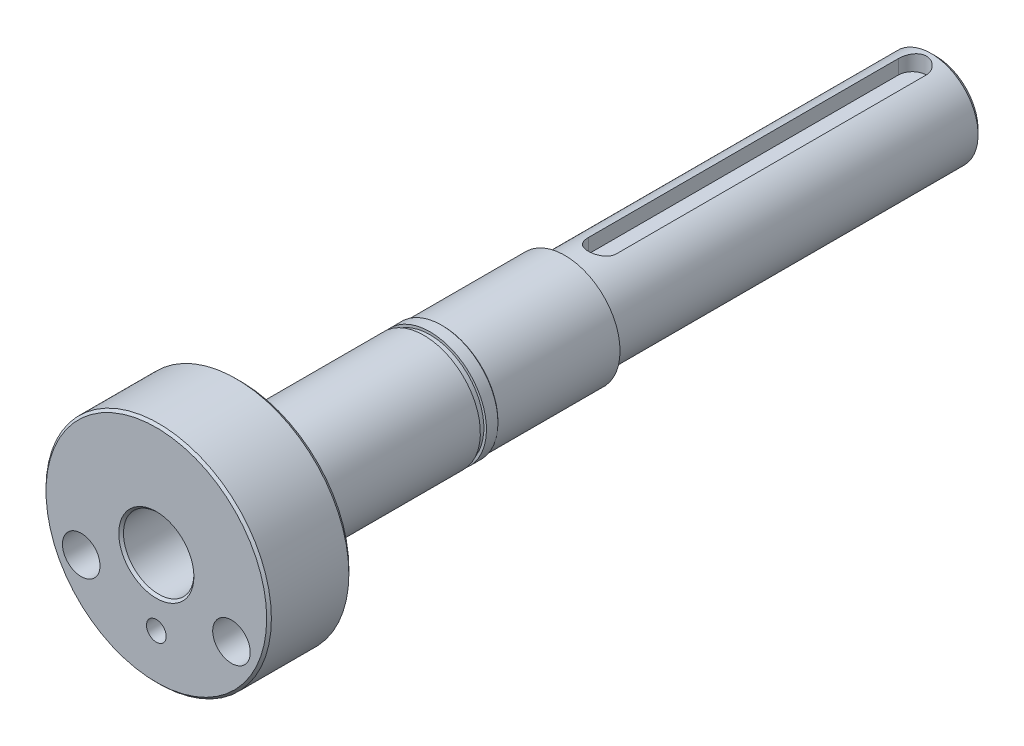
ISO-10303-21;
HEADER;
FILE_DESCRIPTION(('STEP AP214'),'2;1');
FILE_NAME('part.step','',(''),(''),'','','');
FILE_SCHEMA(('AUTOMOTIVE_DESIGN { 1 0 10303 214 1 1 1 1 }'));
ENDSEC;
DATA;
#1=APPLICATION_CONTEXT('core data for automotive mechanical design processes');
#2=APPLICATION_PROTOCOL_DEFINITION('international standard','automotive_design',2000,#1);
#3=PRODUCT_CONTEXT('',#1,'mechanical');
#4=PRODUCT('Part','Part','',(#3));
#5=PRODUCT_RELATED_PRODUCT_CATEGORY('part','',(#4));
#6=PRODUCT_DEFINITION_FORMATION('','',#4);
#7=PRODUCT_DEFINITION_CONTEXT('part definition',#1,'design');
#8=PRODUCT_DEFINITION('design','',#6,#7);
#9=PRODUCT_DEFINITION_SHAPE('','',#8);
#10=(LENGTH_UNIT() NAMED_UNIT(*) SI_UNIT(.MILLI.,.METRE.));
#11=(NAMED_UNIT(*) PLANE_ANGLE_UNIT() SI_UNIT($,.RADIAN.));
#12=(NAMED_UNIT(*) SI_UNIT($,.STERADIAN.) SOLID_ANGLE_UNIT());
#13=UNCERTAINTY_MEASURE_WITH_UNIT(LENGTH_MEASURE(1.E-05),#10,'distance_accuracy_value','');
#14=(GEOMETRIC_REPRESENTATION_CONTEXT(3) GLOBAL_UNCERTAINTY_ASSIGNED_CONTEXT((#13)) GLOBAL_UNIT_ASSIGNED_CONTEXT((#10,
#11,#12)) REPRESENTATION_CONTEXT('',''));
#15=CARTESIAN_POINT('',(0.,0.,0.));
#16=DIRECTION('',(0.,0.,1.));
#17=DIRECTION('',(1.,0.,0.));
#18=AXIS2_PLACEMENT_3D('',#15,#16,#17);
#19=CARTESIAN_POINT('',(0.,0.,0.));
#20=DIRECTION('',(0.,0.,1.));
#21=DIRECTION('',(1.00000000000001,0.,0.));
#22=AXIS2_PLACEMENT_3D('',#19,#20,#21);
#23=PLANE('',#22);
#24=CARTESIAN_POINT('',(0.,0.,0.));
#25=DIRECTION('',(0.,0.,1.));
#26=DIRECTION('',(1.00000000000001,0.,0.));
#27=AXIS2_PLACEMENT_3D('',#24,#25,#26);
#28=CIRCLE('',#27,23.);
#29=CARTESIAN_POINT('',(23.0000000000002,0.,0.));
#30=VERTEX_POINT('',#29);
#31=EDGE_CURVE('E168',#30,#30,#28,.F.);
#32=ORIENTED_EDGE('',*,*,#31,.T.);
#33=EDGE_LOOP('',(#32));
#34=FACE_BOUND('',#33,.T.);
#35=CARTESIAN_POINT('',(16.0000000000001,-8.00000000000045,0.));
#36=DIRECTION('',(0.,0.,1.));
#37=DIRECTION('',(1.00000000000001,0.,0.));
#38=AXIS2_PLACEMENT_3D('',#35,#36,#37);
#39=CIRCLE('',#38,3.99999999999999);
#40=CARTESIAN_POINT('',(20.0000000000002,-8.00000000000045,0.));
#41=VERTEX_POINT('',#40);
#42=EDGE_CURVE('E136',#41,#41,#39,.T.);
#43=ORIENTED_EDGE('',*,*,#42,.T.);
#44=EDGE_LOOP('',(#43));
#45=FACE_BOUND('',#44,.T.);
#46=CARTESIAN_POINT('',(-16.0000000000002,-8.00000000000006,-1.2490009027033E-13));
#47=DIRECTION('',(0.,0.,1.));
#48=DIRECTION('',(1.00000000000001,0.,0.));
#49=AXIS2_PLACEMENT_3D('',#46,#47,#48);
#50=CIRCLE('',#49,4.);
#51=CARTESIAN_POINT('',(-12.0000000000001,-8.00000000000006,-1.2490009027033E-13));
#52=VERTEX_POINT('',#51);
#53=EDGE_CURVE('E132',#52,#52,#50,.T.);
#54=ORIENTED_EDGE('',*,*,#53,.T.);
#55=EDGE_LOOP('',(#54));
#56=FACE_BOUND('',#55,.T.);
#57=CARTESIAN_POINT('',(0.,-14.,0.));
#58=DIRECTION('',(0.,0.,1.));
#59=DIRECTION('',(1.00000000000001,0.,0.));
#60=AXIS2_PLACEMENT_3D('',#57,#58,#59);
#61=CIRCLE('',#60,2.09999999999999);
#62=CARTESIAN_POINT('',(0.592633240852417,-11.9853571428571,0.));
#63=VERTEX_POINT('',#62);
#64=CARTESIAN_POINT('',(-0.592633240852417,-11.9853571428576,0.));
#65=VERTEX_POINT('',#64);
#66=EDGE_CURVE('E127',#63,#65,#61,.F.);
#67=ORIENTED_EDGE('',*,*,#66,.F.);
#68=CARTESIAN_POINT('',(0.,0.,0.));
#69=DIRECTION('',(0.,0.,1.));
#70=DIRECTION('',(1.00000000000001,0.,0.));
#71=AXIS2_PLACEMENT_3D('',#68,#69,#70);
#72=CIRCLE('',#71,12.);
#73=EDGE_CURVE('E161',#65,#63,#72,.F.);
#74=ORIENTED_EDGE('',*,*,#73,.F.);
#75=EDGE_LOOP('',(#67,#74));
#76=FACE_BOUND('',#75,.T.);
#77=ADVANCED_FACE('F36',(#34,#45,#56,#76),#23,.F.);
#78=CARTESIAN_POINT('',(0.,-4.9960036108132E-13,18.));
#79=DIRECTION('',(0.,0.,1.));
#80=DIRECTION('',(1.00000000000001,0.,0.));
#81=AXIS2_PLACEMENT_3D('',#78,#79,#80);
#82=PLANE('',#81);
#83=CARTESIAN_POINT('',(0.,-14.0000000000005,18.));
#84=DIRECTION('',(0.,0.,1.));
#85=DIRECTION('',(1.00000000000001,0.,0.));
#86=AXIS2_PLACEMENT_3D('',#83,#84,#85);
#87=CIRCLE('',#86,2.09999999999999);
#88=CARTESIAN_POINT('',(2.10000000000005,-14.0000000000005,18.));
#89=VERTEX_POINT('',#88);
#90=EDGE_CURVE('E117',#89,#89,#87,.T.);
#91=ORIENTED_EDGE('',*,*,#90,.F.);
#92=EDGE_LOOP('',(#91));
#93=FACE_BOUND('',#92,.T.);
#94=CARTESIAN_POINT('',(-16.,-8.00000000000001,18.));
#95=DIRECTION('',(0.,0.,1.));
#96=DIRECTION('',(1.00000000000001,0.,0.));
#97=AXIS2_PLACEMENT_3D('',#94,#95,#96);
#98=CIRCLE('',#97,4.);
#99=CARTESIAN_POINT('',(-12.,-8.00000000000001,18.));
#100=VERTEX_POINT('',#99);
#101=EDGE_CURVE('E129',#100,#100,#98,.T.);
#102=ORIENTED_EDGE('',*,*,#101,.F.);
#103=EDGE_LOOP('',(#102));
#104=FACE_BOUND('',#103,.T.);
#105=CARTESIAN_POINT('',(16.0000000000002,-8.00000000000001,18.));
#106=DIRECTION('',(0.,0.,1.));
#107=DIRECTION('',(1.00000000000001,0.,0.));
#108=AXIS2_PLACEMENT_3D('',#105,#106,#107);
#109=CIRCLE('',#108,3.99999999999999);
#110=CARTESIAN_POINT('',(20.0000000000003,-8.00000000000001,18.));
#111=VERTEX_POINT('',#110);
#112=EDGE_CURVE('E133',#111,#111,#109,.T.);
#113=ORIENTED_EDGE('',*,*,#112,.F.);
#114=EDGE_LOOP('',(#113));
#115=FACE_BOUND('',#114,.T.);
#116=CARTESIAN_POINT('',(0.,-4.9960036108132E-13,18.));
#117=DIRECTION('',(0.,0.,1.));
#118=DIRECTION('',(1.00000000000001,0.,0.));
#119=AXIS2_PLACEMENT_3D('',#116,#117,#118);
#120=CIRCLE('',#119,8.);
#121=CARTESIAN_POINT('',(8.00000000000011,-4.99600361081321E-13,18.));
#122=VERTEX_POINT('',#121);
#123=EDGE_CURVE('E186',#122,#122,#120,.F.);
#124=ORIENTED_EDGE('',*,*,#123,.T.);
#125=EDGE_LOOP('',(#124));
#126=FACE_BOUND('',#125,.T.);
#127=CARTESIAN_POINT('',(0.,-4.9960036108132E-13,18.));
#128=DIRECTION('',(0.,0.,1.));
#129=DIRECTION('',(1.00000000000001,0.,0.));
#130=AXIS2_PLACEMENT_3D('',#127,#128,#129);
#131=CIRCLE('',#130,23.5);
#132=CARTESIAN_POINT('',(23.5000000000002,-4.99600361081322E-13,18.));
#133=VERTEX_POINT('',#132);
#134=EDGE_CURVE('E177',#133,#133,#131,.T.);
#135=ORIENTED_EDGE('',*,*,#134,.T.);
#136=EDGE_LOOP('',(#135));
#137=FACE_BOUND('',#136,.T.);
#138=ADVANCED_FACE('F274',(#93,#104,#115,#126,#137),#82,.T.);
#139=CARTESIAN_POINT('',(0.,-4.9960036108132E-13,-69.));
#140=DIRECTION('',(0.,0.,-1.));
#141=DIRECTION('',(-1.00000000000001,0.,0.));
#142=AXIS2_PLACEMENT_3D('',#139,#140,#141);
#143=PLANE('',#142);
#144=CARTESIAN_POINT('',(0.,-4.9960036108132E-13,-69.));
#145=DIRECTION('',(0.,0.,-1.));
#146=DIRECTION('',(-1.00000000000001,0.,0.));
#147=AXIS2_PLACEMENT_3D('',#144,#145,#146);
#148=CIRCLE('',#147,11.75);
#149=CARTESIAN_POINT('',(11.7500000000001,-4.99600361081321E-13,-69.));
#150=VERTEX_POINT('',#149);
#151=EDGE_CURVE('E146',#150,#150,#148,.T.);
#152=ORIENTED_EDGE('',*,*,#151,.T.);
#153=EDGE_LOOP('',(#152));
#154=FACE_BOUND('',#153,.T.);
#155=CARTESIAN_POINT('',(0.,-4.9960036108132E-13,-69.));
#156=DIRECTION('',(0.,0.,-1.));
#157=DIRECTION('',(-1.00000000000001,0.,0.));
#158=AXIS2_PLACEMENT_3D('',#155,#156,#157);
#159=CIRCLE('',#158,10.);
#160=CARTESIAN_POINT('',(-10.,-4.9960036108132E-13,-69.));
#161=VERTEX_POINT('',#160);
#162=EDGE_CURVE('E140',#161,#161,#159,.T.);
#163=ORIENTED_EDGE('',*,*,#162,.F.);
#164=EDGE_LOOP('',(#163));
#165=FACE_BOUND('',#164,.T.);
#166=ADVANCED_FACE('F280',(#154,#165),#143,.T.);
#167=CARTESIAN_POINT('',(0.,-4.9960036108132E-13,-39.));
#168=DIRECTION('',(0.,0.,-1.));
#169=DIRECTION('',(-1.00000000000001,0.,0.));
#170=AXIS2_PLACEMENT_3D('',#167,#168,#169);
#171=PLANE('',#170);
#172=CARTESIAN_POINT('',(0.,-4.9960036108132E-13,-39.));
#173=DIRECTION('',(0.,0.,-1.));
#174=DIRECTION('',(-1.00000000000001,0.,0.));
#175=AXIS2_PLACEMENT_3D('',#172,#173,#174);
#176=CIRCLE('',#175,12.);
#177=CARTESIAN_POINT('',(-12.0000000000001,-4.9960036108132E-13,-39.));
#178=VERTEX_POINT('',#177);
#179=EDGE_CURVE('E158',#178,#178,#176,.T.);
#180=ORIENTED_EDGE('',*,*,#179,.T.);
#181=EDGE_LOOP('',(#180));
#182=FACE_BOUND('',#181,.T.);
#183=CARTESIAN_POINT('',(0.,-4.9960036108132E-13,-39.));
#184=DIRECTION('',(0.,0.,-1.));
#185=DIRECTION('',(-1.00000000000001,0.,0.));
#186=AXIS2_PLACEMENT_3D('',#183,#184,#185);
#187=CIRCLE('',#186,11.45);
#188=CARTESIAN_POINT('',(-11.4500000000001,-4.9960036108132E-13,-39.));
#189=VERTEX_POINT('',#188);
#190=EDGE_CURVE('E152',#189,#189,#187,.T.);
#191=ORIENTED_EDGE('',*,*,#190,.F.);
#192=EDGE_LOOP('',(#191));
#193=FACE_BOUND('',#192,.T.);
#194=ADVANCED_FACE('F289',(#182,#193),#171,.T.);
#195=CARTESIAN_POINT('',(0.,-4.9960036108132E-13,18.));
#196=DIRECTION('',(0.,0.,-1.));
#197=DIRECTION('',(-1.00000000000001,0.,0.));
#198=AXIS2_PLACEMENT_3D('',#195,#196,#197);
#199=CYLINDRICAL_SURFACE('',#198,24.);
#200=CARTESIAN_POINT('',(0.,-4.9960036108132E-13,17.5));
#201=DIRECTION('',(0.,0.,1.));
#202=DIRECTION('',(1.00000000000001,0.,0.));
#203=AXIS2_PLACEMENT_3D('',#200,#201,#202);
#204=CIRCLE('',#203,24.);
#205=CARTESIAN_POINT('',(24.0000000000002,-4.99600361081322E-13,17.5));
#206=VERTEX_POINT('',#205);
#207=EDGE_CURVE('E180',#206,#206,#204,.F.);
#208=ORIENTED_EDGE('',*,*,#207,.T.);
#209=EDGE_LOOP('',(#208));
#210=FACE_BOUND('',#209,.T.);
#211=CARTESIAN_POINT('',(0.,0.,1.));
#212=DIRECTION('',(0.,0.,1.));
#213=DIRECTION('',(1.00000000000001,0.,0.));
#214=AXIS2_PLACEMENT_3D('',#211,#212,#213);
#215=CIRCLE('',#214,24.);
#216=CARTESIAN_POINT('',(24.0000000000002,0.,1.));
#217=VERTEX_POINT('',#216);
#218=EDGE_CURVE('E165',#217,#217,#215,.T.);
#219=ORIENTED_EDGE('',*,*,#218,.T.);
#220=EDGE_LOOP('',(#219));
#221=FACE_BOUND('',#220,.T.);
#222=ADVANCED_FACE('F38',(#210,#221),#199,.T.);
#223=CARTESIAN_POINT('',(0.,-4.9960036108132E-13,-39.));
#224=DIRECTION('',(0.,0.,1.));
#225=DIRECTION('',(1.00000000000001,0.,0.));
#226=AXIS2_PLACEMENT_3D('',#223,#224,#225);
#227=CYLINDRICAL_SURFACE('',#226,12.);
#228=ORIENTED_EDGE('',*,*,#179,.F.);
#229=EDGE_LOOP('',(#228));
#230=FACE_BOUND('',#229,.T.);
#231=EDGE_CURVE('E162',#63,#65,#72,.F.);
#232=ORIENTED_EDGE('',*,*,#231,.T.);
#233=ORIENTED_EDGE('',*,*,#73,.T.);
#234=EDGE_LOOP('',(#232,#233));
#235=FACE_BOUND('',#234,.T.);
#236=ADVANCED_FACE('F284',(#230,#235),#227,.T.);
#237=CARTESIAN_POINT('',(0.,0.,-40.3));
#238=DIRECTION('',(0.,0.,1.));
#239=DIRECTION('',(1.00000000000001,0.,0.));
#240=AXIS2_PLACEMENT_3D('',#237,#238,#239);
#241=CYLINDRICAL_SURFACE('',#240,11.45);
#242=CARTESIAN_POINT('',(0.,0.,-40.3));
#243=DIRECTION('',(0.,0.,-1.));
#244=DIRECTION('',(-1.00000000000001,0.,0.));
#245=AXIS2_PLACEMENT_3D('',#242,#243,#244);
#246=CIRCLE('',#245,11.45);
#247=CARTESIAN_POINT('',(-11.4500000000001,0.,-40.3));
#248=VERTEX_POINT('',#247);
#249=EDGE_CURVE('E155',#248,#248,#246,.T.);
#250=ORIENTED_EDGE('',*,*,#249,.F.);
#251=EDGE_LOOP('',(#250));
#252=FACE_BOUND('',#251,.T.);
#253=ORIENTED_EDGE('',*,*,#190,.T.);
#254=EDGE_LOOP('',(#253));
#255=FACE_BOUND('',#254,.T.);
#256=ADVANCED_FACE('F287',(#252,#255),#241,.T.);
#257=CARTESIAN_POINT('',(0.,0.,-40.3));
#258=DIRECTION('',(0.,0.,-1.));
#259=DIRECTION('',(-1.00000000000001,0.,0.));
#260=AXIS2_PLACEMENT_3D('',#257,#258,#259);
#261=PLANE('',#260);
#262=CARTESIAN_POINT('',(0.,0.,-40.3));
#263=DIRECTION('',(0.,0.,-1.));
#264=DIRECTION('',(-1.00000000000001,0.,0.));
#265=AXIS2_PLACEMENT_3D('',#262,#263,#264);
#266=CIRCLE('',#265,12.);
#267=CARTESIAN_POINT('',(-12.0000000000001,0.,-40.3));
#268=VERTEX_POINT('',#267);
#269=EDGE_CURVE('E149',#268,#268,#266,.T.);
#270=ORIENTED_EDGE('',*,*,#269,.F.);
#271=EDGE_LOOP('',(#270));
#272=FACE_BOUND('',#271,.T.);
#273=ORIENTED_EDGE('',*,*,#249,.T.);
#274=EDGE_LOOP('',(#273));
#275=FACE_BOUND('',#274,.T.);
#276=ADVANCED_FACE('F295',(#272,#275),#261,.F.);
#277=CARTESIAN_POINT('',(0.,0.,-43.));
#278=DIRECTION('',(0.,0.,1.));
#279=DIRECTION('',(1.00000000000001,0.,0.));
#280=AXIS2_PLACEMENT_3D('',#277,#278,#279);
#281=CYLINDRICAL_SURFACE('',#280,12.);
#282=CARTESIAN_POINT('',(0.,0.,-42.7500000000001));
#283=DIRECTION('',(0.,0.,-1.));
#284=DIRECTION('',(0.,1.,0.));
#285=AXIS2_PLACEMENT_3D('',#282,#283,#284);
#286=CIRCLE('',#285,12.);
#287=CARTESIAN_POINT('',(0.,12.,-42.7500000000001));
#288=VERTEX_POINT('',#287);
#289=EDGE_CURVE('E11',#288,#288,#286,.F.);
#290=ORIENTED_EDGE('',*,*,#289,.T.);
#291=EDGE_LOOP('',(#290));
#292=FACE_BOUND('',#291,.T.);
#293=ORIENTED_EDGE('',*,*,#269,.T.);
#294=EDGE_LOOP('',(#293));
#295=FACE_BOUND('',#294,.T.);
#296=ADVANCED_FACE('F297',(#292,#295),#281,.T.);
#297=CARTESIAN_POINT('',(0.,-4.9960036108132E-13,-69.));
#298=DIRECTION('',(0.,0.,1.));
#299=DIRECTION('',(1.00000000000001,0.,0.));
#300=AXIS2_PLACEMENT_3D('',#297,#298,#299);
#301=CYLINDRICAL_SURFACE('',#300,11.75);
#302=CARTESIAN_POINT('',(0.,0.,-43.));
#303=DIRECTION('',(0.,0.,-1.));
#304=DIRECTION('',(-1.00000000000001,0.,0.));
#305=AXIS2_PLACEMENT_3D('',#302,#303,#304);
#306=CIRCLE('',#305,11.75);
#307=CARTESIAN_POINT('',(11.7500000000001,-4.99600361081321E-13,-43.));
#308=VERTEX_POINT('',#307);
#309=EDGE_CURVE('E143',#308,#308,#306,.T.);
#310=CARTESIAN_POINT('',(11.7500000000001,-4.99600361081321E-13,-69.));
#311=CARTESIAN_POINT('',(11.7500000000001,-4.99600361081321E-13,-68.7291666666667));
#312=CARTESIAN_POINT('',(11.7500000000001,-4.99600361081321E-13,-68.4583333333334));
#313=CARTESIAN_POINT('',(11.7500000000001,-4.99600361081321E-13,-67.9166666666667));
#314=CARTESIAN_POINT('',(11.7500000000001,-4.99600361081321E-13,-67.6458333333334));
#315=CARTESIAN_POINT('',(11.7500000000001,-4.99600361081321E-13,-67.1041666666667));
#316=CARTESIAN_POINT('',(11.7500000000001,-4.99600361081321E-13,-66.8333333333334));
#317=CARTESIAN_POINT('',(11.7500000000001,-4.99600361081321E-13,-66.2916666666667));
#318=CARTESIAN_POINT('',(11.7500000000001,-4.99600361081321E-13,-66.0208333333334));
#319=CARTESIAN_POINT('',(11.7500000000001,-4.99600361081321E-13,-65.4791666666667));
#320=CARTESIAN_POINT('',(11.7500000000001,-4.99600361081321E-13,-65.2083333333334));
#321=CARTESIAN_POINT('',(11.7500000000001,-4.99600361081321E-13,-64.6666666666667));
#322=CARTESIAN_POINT('',(11.7500000000001,-4.99600361081321E-13,-64.3958333333334));
#323=CARTESIAN_POINT('',(11.7500000000001,-4.99600361081321E-13,-63.8541666666667));
#324=CARTESIAN_POINT('',(11.7500000000001,-4.99600361081321E-13,-63.5833333333333));
#325=CARTESIAN_POINT('',(11.7500000000001,-4.99600361081321E-13,-63.0416666666667));
#326=CARTESIAN_POINT('',(11.7500000000001,-4.99600361081321E-13,-62.7708333333334));
#327=CARTESIAN_POINT('',(11.7500000000001,-4.99600361081321E-13,-62.2291666666667));
#328=CARTESIAN_POINT('',(11.7500000000001,-4.99600361081321E-13,-61.9583333333334));
#329=CARTESIAN_POINT('',(11.7500000000001,-4.99600361081321E-13,-61.4166666666667));
#330=CARTESIAN_POINT('',(11.7500000000001,-4.99600361081321E-13,-61.1458333333334));
#331=CARTESIAN_POINT('',(11.7500000000001,-4.99600361081321E-13,-60.6041666666667));
#332=CARTESIAN_POINT('',(11.7500000000001,-4.99600361081321E-13,-60.3333333333334));
#333=CARTESIAN_POINT('',(11.7500000000001,-4.99600361081321E-13,-59.7916666666667));
#334=CARTESIAN_POINT('',(11.7500000000001,-4.99600361081321E-13,-59.5208333333334));
#335=CARTESIAN_POINT('',(11.7500000000001,-4.99600361081321E-13,-58.9791666666667));
#336=CARTESIAN_POINT('',(11.7500000000001,-4.99600361081321E-13,-58.7083333333334));
#337=CARTESIAN_POINT('',(11.7500000000001,-4.99600361081321E-13,-58.1666666666667));
#338=CARTESIAN_POINT('',(11.7500000000001,-4.99600361081321E-13,-57.8958333333334));
#339=CARTESIAN_POINT('',(11.7500000000001,-4.99600361081321E-13,-57.3541666666667));
#340=CARTESIAN_POINT('',(11.7500000000001,-4.99600361081321E-13,-57.0833333333334));
#341=CARTESIAN_POINT('',(11.7500000000001,-4.99600361081321E-13,-56.5416666666667));
#342=CARTESIAN_POINT('',(11.7500000000001,-4.99600361081321E-13,-56.2708333333334));
#343=CARTESIAN_POINT('',(11.7500000000001,-4.99600361081321E-13,-55.7291666666667));
#344=CARTESIAN_POINT('',(11.7500000000001,-4.99600361081321E-13,-55.4583333333334));
#345=CARTESIAN_POINT('',(11.7500000000001,-4.99600361081321E-13,-54.9166666666667));
#346=CARTESIAN_POINT('',(11.7500000000001,-4.99600361081321E-13,-54.6458333333334));
#347=CARTESIAN_POINT('',(11.7500000000001,-4.99600361081321E-13,-54.1041666666667));
#348=CARTESIAN_POINT('',(11.7500000000001,-4.99600361081321E-13,-53.8333333333334));
#349=CARTESIAN_POINT('',(11.7500000000001,-4.99600361081321E-13,-53.2916666666667));
#350=CARTESIAN_POINT('',(11.7500000000001,-4.99600361081321E-13,-53.0208333333334));
#351=CARTESIAN_POINT('',(11.7500000000001,-4.99600361081321E-13,-52.4791666666667));
#352=CARTESIAN_POINT('',(11.7500000000001,-4.99600361081321E-13,-52.2083333333334));
#353=CARTESIAN_POINT('',(11.7500000000001,-4.99600361081321E-13,-51.6666666666667));
#354=CARTESIAN_POINT('',(11.7500000000001,-4.99600361081321E-13,-51.3958333333334));
#355=CARTESIAN_POINT('',(11.7500000000001,-4.99600361081321E-13,-50.8541666666667));
#356=CARTESIAN_POINT('',(11.7500000000001,-4.99600361081321E-13,-50.5833333333334));
#357=CARTESIAN_POINT('',(11.7500000000001,-4.99600361081321E-13,-50.0416666666667));
#358=CARTESIAN_POINT('',(11.7500000000001,-4.99600361081321E-13,-49.7708333333334));
#359=CARTESIAN_POINT('',(11.7500000000001,-4.99600361081321E-13,-49.2291666666667));
#360=CARTESIAN_POINT('',(11.7500000000001,-4.99600361081321E-13,-48.9583333333334));
#361=CARTESIAN_POINT('',(11.7500000000001,-4.99600361081321E-13,-48.4166666666667));
#362=CARTESIAN_POINT('',(11.7500000000001,-4.99600361081321E-13,-48.1458333333334));
#363=CARTESIAN_POINT('',(11.7500000000001,-4.99600361081321E-13,-47.6041666666667));
#364=CARTESIAN_POINT('',(11.7500000000001,-4.99600361081321E-13,-47.3333333333334));
#365=CARTESIAN_POINT('',(11.7500000000001,-4.99600361081321E-13,-46.7916666666667));
#366=CARTESIAN_POINT('',(11.7500000000001,-4.99600361081321E-13,-46.5208333333334));
#367=CARTESIAN_POINT('',(11.7500000000001,-4.99600361081321E-13,-45.9791666666667));
#368=CARTESIAN_POINT('',(11.7500000000001,-4.99600361081321E-13,-45.7083333333334));
#369=CARTESIAN_POINT('',(11.7500000000001,-4.99600361081321E-13,-45.1666666666667));
#370=CARTESIAN_POINT('',(11.7500000000001,-4.99600361081321E-13,-44.8958333333334));
#371=CARTESIAN_POINT('',(11.7500000000001,-4.99600361081321E-13,-44.3541666666667));
#372=CARTESIAN_POINT('',(11.7500000000001,-4.99600361081321E-13,-44.0833333333334));
#373=CARTESIAN_POINT('',(11.7500000000001,-4.99600361081321E-13,-43.5416666666667));
#374=CARTESIAN_POINT('',(11.7500000000001,-4.99600361081321E-13,-43.2708333333334));
#375=CARTESIAN_POINT('',(11.7500000000001,-4.99600361081321E-13,-43.));
#376=B_SPLINE_CURVE_WITH_KNOTS('',3,(#310,#311,#312,#313,#314,#315,#316,#317,#318,#319,#320,
#321,#322,#323,#324,#325,#326,#327,#328,#329,#330,#331,#332,#333,#334,#335,#336,#337,#338,#339,
#340,#341,#342,#343,#344,#345,#346,#347,#348,#349,#350,#351,#352,#353,#354,#355,#356,#357,#358,
#359,#360,#361,#362,#363,#364,#365,#366,#367,#368,#369,#370,#371,#372,#373,#374,#375),
.UNSPECIFIED.,.F.,.F.,(4,2,2,2,2,2,2,2,2,2,2,2,2,2,2,2,2,2,2,2,2,2,2,2,2,2,2,2,2,2,2,2,4),(0.,
0.812500000000008,1.625,2.43750000000001,3.25,4.06250000000001,4.875,5.68750000000001,
6.50000000000001,7.31250000000001,8.12500000000001,8.93750000000001,9.75000000000001,10.5625,
11.375,12.1875,13.,13.8125,14.625,15.4375,16.25,17.0625,17.875,18.6875,19.5,20.3125,21.125,
21.9375,22.75,23.5625,24.375,25.1875,26.),.UNSPECIFIED.);
#377=EDGE_CURVE('BSEAM269',#150,#308,#376,.T.);
#378=ORIENTED_EDGE('',*,*,#151,.F.);
#379=ORIENTED_EDGE('',*,*,#309,.T.);
#380=ORIENTED_EDGE('',*,*,#377,.T.);
#381=ORIENTED_EDGE('',*,*,#377,.F.);
#382=EDGE_LOOP('',(#378,#380,#379,#381));
#383=FACE_BOUND('',#382,.T.);
#384=ADVANCED_FACE('F269',(#383),#301,.T.);
#385=CARTESIAN_POINT('',(0.,0.,-148.));
#386=DIRECTION('',(0.,0.,1.));
#387=DIRECTION('',(1.00000000000001,0.,0.));
#388=AXIS2_PLACEMENT_3D('',#385,#386,#387);
#389=CYLINDRICAL_SURFACE('',#388,10.);
#390=CARTESIAN_POINT('',(0.,9.99999999999951,-74.));
#391=CARTESIAN_POINT('',(-0.164577225506592,9.9999985850105,-74.0000019949698));
#392=CARTESIAN_POINT('',(-0.329174636703056,9.99589831387893,-74.013587727248));
#393=CARTESIAN_POINT('',(-0.653576250609761,9.97994211187396,-74.0674427084442));
#394=CARTESIAN_POINT('',(-0.813379008822838,9.9680838677939,-74.1077199160467));
#395=CARTESIAN_POINT('',(-1.12346541550904,9.93791105003672,-74.2134920338206));
#396=CARTESIAN_POINT('',(-1.27376272879072,9.91960600500852,-74.2789497392379));
#397=CARTESIAN_POINT('',(-1.56124836210625,9.8784421847529,-74.4330721861117));
#398=CARTESIAN_POINT('',(-1.69843493493934,9.85558280384131,-74.5217400147909));
#399=CARTESIAN_POINT('',(-1.95974359436751,9.80701474385551,-74.7224480149454));
#400=CARTESIAN_POINT('',(-2.08343614248869,9.78124767314083,-74.8350332517719));
#401=CARTESIAN_POINT('',(-2.31049841846647,9.73011668420873,-75.0792184598205));
#402=CARTESIAN_POINT('',(-2.4138647265488,9.70475283448962,-75.21082162425));
#403=CARTESIAN_POINT('',(-2.59960075447412,9.65668227987503,-75.4929415060753));
#404=CARTESIAN_POINT('',(-2.68144618044424,9.63404813327739,-75.6438169219816));
#405=CARTESIAN_POINT('',(-2.81842789549518,9.59487240788074,-75.9579785084607));
#406=CARTESIAN_POINT('',(-2.87357059839944,9.57832936626625,-76.121261687856));
#407=CARTESIAN_POINT('',(-2.95403267365299,9.55381741676867,-76.4507805322609));
#408=CARTESIAN_POINT('',(-2.98014392469349,9.54562138649067,-76.6168054877279));
#409=CARTESIAN_POINT('',(-3.00427461229341,9.53805579499537,-76.9510663124336));
#410=CARTESIAN_POINT('',(-3.00230085522157,9.53868409521144,-77.1193016361182));
#411=CARTESIAN_POINT('',(-2.97093954399624,9.54849488135556,-77.446767817217));
#412=CARTESIAN_POINT('',(-2.94254410525367,9.55736777198282,-77.6061045007245));
#413=CARTESIAN_POINT('',(-2.86074840854108,9.5821671245725,-77.9176395725469));
#414=CARTESIAN_POINT('',(-2.80734568283281,9.59809428264703,-78.0698372547487));
#415=CARTESIAN_POINT('',(-2.67632053307362,9.63545466149948,-78.3652006993215));
#416=CARTESIAN_POINT('',(-2.59837633869282,9.65696032231907,-78.5082141679106));
#417=CARTESIAN_POINT('',(-2.42070445177363,9.70301974000129,-78.7794640440204));
#418=CARTESIAN_POINT('',(-2.32097148005174,9.7275742349398,-78.9076968588276));
#419=CARTESIAN_POINT('',(-2.09762581531093,9.77822022595878,-79.1513723815241));
#420=CARTESIAN_POINT('',(-1.97318981493395,9.80433308621009,-79.2660573280593));
#421=CARTESIAN_POINT('',(-1.70652651862793,9.85424488126504,-79.4731079681285));
#422=CARTESIAN_POINT('',(-1.56429810372175,9.87804367036772,-79.5654722568289));
#423=CARTESIAN_POINT('',(-1.26471007668558,9.92086320138893,-79.7257198449295));
#424=CARTESIAN_POINT('',(-1.10725549949589,9.93985087336616,-79.7934350324998));
#425=CARTESIAN_POINT('',(-0.782490831207041,9.97067043664456,-79.9011991801993));
#426=CARTESIAN_POINT('',(-0.615183503179156,9.98250432373999,-79.941255857065));
#427=CARTESIAN_POINT('',(-0.281904485336648,9.99736729287078,-79.9913043557988));
#428=CARTESIAN_POINT('',(-0.11610019520236,10.0006970083559,-80.0023231716033));
#429=CARTESIAN_POINT('',(0.214999211646772,9.99905846483506,-79.9968616885759));
#430=CARTESIAN_POINT('',(0.380294393381561,9.99409131355462,-79.9803850606971));
#431=CARTESIAN_POINT('',(0.701807210619416,9.97661393974273,-79.921230777777));
#432=CARTESIAN_POINT('',(0.858145545228389,9.96427659598815,-79.8791532248383));
#433=CARTESIAN_POINT('',(1.1615092779091,9.93348695683082,-79.7707135344436));
#434=CARTESIAN_POINT('',(1.30853355405121,9.91503392642187,-79.7043484779243));
#435=CARTESIAN_POINT('',(1.59287437892214,9.87339308702629,-79.5474936690378));
#436=CARTESIAN_POINT('',(1.72988765239939,9.8501056165929,-79.4564813181041));
#437=CARTESIAN_POINT('',(1.98704661596036,9.80146937528692,-79.2535504918944));
#438=CARTESIAN_POINT('',(2.10718806471193,9.77612008862373,-79.1416267762248));
#439=CARTESIAN_POINT('',(2.33171489102056,9.72506343737956,-78.8952253832613));
#440=CARTESIAN_POINT('',(2.43536962463006,9.69937650065495,-78.7600762484564));
#441=CARTESIAN_POINT('',(2.6185799014432,9.65153030477964,-78.4737441219731));
#442=CARTESIAN_POINT('',(2.69813607658973,9.62937095313138,-78.3225615508843));
#443=CARTESIAN_POINT('',(2.83034694254322,9.59134379226319,-78.00893501749));
#444=CARTESIAN_POINT('',(2.88312693874026,9.57544675673502,-77.8465476269244));
#445=CARTESIAN_POINT('',(2.96043461630311,9.55183188739732,-77.5146240621395));
#446=CARTESIAN_POINT('',(2.98497197957857,9.54411125069385,-77.3450903584339));
#447=CARTESIAN_POINT('',(3.00443968969938,9.53799944941558,-77.0112769632232));
#448=CARTESIAN_POINT('',(3.00056110615891,9.53923294700394,-76.8470726979012));
#449=CARTESIAN_POINT('',(2.96615010888614,9.54998802392186,-76.5217717931988));
#450=CARTESIAN_POINT('',(2.93561876249412,9.55950927135898,-76.360675029639));
#451=CARTESIAN_POINT('',(2.84953777608691,9.5855152738924,-76.0481092017367));
#452=CARTESIAN_POINT('',(2.79430351014252,9.60191209104932,-75.8965454252827));
#453=CARTESIAN_POINT('',(2.66063014242152,9.63980557805264,-75.6047151223586));
#454=CARTESIAN_POINT('',(2.58218659925728,9.66130322385078,-75.4644507647169));
#455=CARTESIAN_POINT('',(2.40097527610181,9.70795352855336,-75.1936737669475));
#456=CARTESIAN_POINT('',(2.29742552186001,9.73321080328579,-75.0637024774797));
#457=CARTESIAN_POINT('',(2.07034869259559,9.78402640899066,-74.8225950033839));
#458=CARTESIAN_POINT('',(1.946816434269,9.80958481647541,-74.7114637210644));
#459=CARTESIAN_POINT('',(1.67893152436653,9.85901873141573,-74.5079531754101));
#460=CARTESIAN_POINT('',(1.53407577158123,9.88282319531423,-74.4162171062891));
#461=CARTESIAN_POINT('',(1.23028274796706,9.92521360911551,-74.2585296601919));
#462=CARTESIAN_POINT('',(1.07135210599792,9.94380199862107,-74.192566223451));
#463=CARTESIAN_POINT('',(0.761515425310585,9.97204349938619,-74.0942094486945));
#464=CARTESIAN_POINT('',(0.611573923908497,9.98244054762151,-74.0589766542335));
#465=CARTESIAN_POINT('',(0.307760390461586,9.99641888988968,-74.0118729495169));
#466=CARTESIAN_POINT('',(0.153889019716299,10.0000013230943,-73.9999981345904));
#467=CARTESIAN_POINT('',(0.,9.99999999999951,-74.));
#468=B_SPLINE_CURVE_WITH_KNOTS('',3,(#390,#391,#392,#393,#394,#395,#396,#397,#398,#399,#400,
#401,#402,#403,#404,#405,#406,#407,#408,#409,#410,#411,#412,#413,#414,#415,#416,#417,#418,#419,
#420,#421,#422,#423,#424,#425,#426,#427,#428,#429,#430,#431,#432,#433,#434,#435,#436,#437,#438,
#439,#440,#441,#442,#443,#444,#445,#446,#447,#448,#449,#450,#451,#452,#453,#454,#455,#456,#457,
#458,#459,#460,#461,#462,#463,#464,#465,#466,#467),.UNSPECIFIED.,.T.,.F.,(4,2,2,2,2,2,2,2,2,2,2,
2,2,2,2,2,2,2,2,2,2,2,2,2,2,2,2,2,2,2,2,2,2,2,2,2,2,2,4),(0.,0.493166407225226,
0.986479929691984,1.47906735260174,1.97172032882541,2.47711205896387,2.98258874577271,
3.4994296200822,4.01614629086444,4.51839378713195,5.02051956638175,5.50452033395349,
5.98856887316002,6.47924852894238,6.97004720317108,7.48134208096327,7.99266913062134,
8.50742093763372,9.0220290705761,9.51817618877084,10.0142570710065,10.4991349336465,
10.9840710918745,11.4802261140581,11.9765056400039,12.4908080064564,13.0050968850536,
13.516956299025,14.0286401892057,14.5190031093854,15.0093463933232,15.4936008081456,
15.9779479511533,16.4799385136898,16.9820594980413,17.4988599232246,18.0154182319959,
18.4766338387004,18.9377723390687),.UNSPECIFIED.);
#469=CARTESIAN_POINT('',(3.00000000000016,9.53939201416942,-76.9999999999999));
#470=VERTEX_POINT('',#469);
#471=CARTESIAN_POINT('',(-3.,9.53939201416948,-77.));
#472=VERTEX_POINT('',#471);
#473=EDGE_CURVE('E200',#470,#472,#468,.T.);
#474=ORIENTED_EDGE('',*,*,#473,.T.);
#475=DIRECTION('',(0.,0.,1.));
#476=VECTOR('',#475,1.);
#477=CARTESIAN_POINT('',(-3.00000000000004,9.53939201416892,-148.));
#478=LINE('',#477,#476);
#479=CARTESIAN_POINT('',(-3.00000000000004,9.53939201416942,-143.));
#480=VERTEX_POINT('',#479);
#481=EDGE_CURVE('E44',#472,#480,#478,.F.);
#482=ORIENTED_EDGE('',*,*,#481,.T.);
#483=CARTESIAN_POINT('',(0.,10.,-140.));
#484=CARTESIAN_POINT('',(-0.164577225506622,9.99999858501105,-140.00000199497));
#485=CARTESIAN_POINT('',(-0.329174636703093,9.99589831387923,-140.013587727248));
#486=CARTESIAN_POINT('',(-0.653576250609794,9.97994211187366,-140.067442708444));
#487=CARTESIAN_POINT('',(-0.813379008822858,9.96808386779328,-140.107719916047));
#488=CARTESIAN_POINT('',(-1.12346541550909,9.93791105003623,-140.213492033821));
#489=CARTESIAN_POINT('',(-1.27376272879082,9.91960600500849,-140.278949739238));
#490=CARTESIAN_POINT('',(-1.56124836210634,9.8784421847529,-140.433072186112));
#491=CARTESIAN_POINT('',(-1.69843493493938,9.85558280384088,-140.521740014791));
#492=CARTESIAN_POINT('',(-1.95974359436751,9.80701474385494,-140.722448014945));
#493=CARTESIAN_POINT('',(-2.08343614248872,9.78124767314058,-140.835033251772));
#494=CARTESIAN_POINT('',(-2.31049841846651,9.73011668420897,-141.07921845982));
#495=CARTESIAN_POINT('',(-2.41386472654884,9.70475283449004,-141.21082162425));
#496=CARTESIAN_POINT('',(-2.59960075447416,9.65668227987538,-141.492941506075));
#497=CARTESIAN_POINT('',(-2.68144618044427,9.63404813327747,-141.643816921981));
#498=CARTESIAN_POINT('',(-2.81842789549522,9.59487240788064,-141.957978508461));
#499=CARTESIAN_POINT('',(-2.87357059839949,9.57832936626622,-142.121261687856));
#500=CARTESIAN_POINT('',(-2.95403267365305,9.55381741676869,-142.450780532261));
#501=CARTESIAN_POINT('',(-2.98014392469356,9.54562138649067,-142.616805487728));
#502=CARTESIAN_POINT('',(-3.00427461229347,9.53805579499532,-142.951066312434));
#503=CARTESIAN_POINT('',(-3.00230085522163,9.53868409521138,-143.119301636118));
#504=CARTESIAN_POINT('',(-2.97093954399629,9.54849488135551,-143.446767817217));
#505=CARTESIAN_POINT('',(-2.94254410525374,9.5573677719828,-143.606104500724));
#506=CARTESIAN_POINT('',(-2.86074840854114,9.58216712457248,-143.917639572547));
#507=CARTESIAN_POINT('',(-2.80734568283286,9.59809428264698,-144.069837254749));
#508=CARTESIAN_POINT('',(-2.67632053307368,9.63545466149943,-144.365200699321));
#509=CARTESIAN_POINT('',(-2.59837633869288,9.65696032231903,-144.508214167911));
#510=CARTESIAN_POINT('',(-2.42070445177368,9.7030197400013,-144.77946404402));
#511=CARTESIAN_POINT('',(-2.32097148005177,9.72757423493982,-144.907696858828));
#512=CARTESIAN_POINT('',(-2.09762581531093,9.77822022595875,-145.151372381524));
#513=CARTESIAN_POINT('',(-1.97318981493396,9.80433308620996,-145.266057328059));
#514=CARTESIAN_POINT('',(-1.70652651862795,9.85424488126517,-145.473107968129));
#515=CARTESIAN_POINT('',(-1.56429810372179,9.87804367036819,-145.565472256829));
#516=CARTESIAN_POINT('',(-1.26471007668564,9.92086320138947,-145.725719844929));
#517=CARTESIAN_POINT('',(-1.10725549949595,9.93985087336642,-145.7934350325));
#518=CARTESIAN_POINT('',(-0.782490831207087,9.97067043664429,-145.901199180199));
#519=CARTESIAN_POINT('',(-0.615183503179194,9.98250432373948,-145.941255857065));
#520=CARTESIAN_POINT('',(-0.28190448533668,9.99736729287029,-145.991304355799));
#521=CARTESIAN_POINT('',(-0.116100195202392,10.0006970083557,-146.002323171603));
#522=CARTESIAN_POINT('',(0.214999211646748,9.99905846483532,-145.996861688576));
#523=CARTESIAN_POINT('',(0.380294393381545,9.99409131355515,-145.980385060697));
#524=CARTESIAN_POINT('',(0.701807210619382,9.97661393974319,-145.921230777777));
#525=CARTESIAN_POINT('',(0.858145545228329,9.96427659598827,-145.879153224838));
#526=CARTESIAN_POINT('',(1.16150927790904,9.93348695683071,-145.770713534444));
#527=CARTESIAN_POINT('',(1.30853355405117,9.91503392642187,-145.704348477924));
#528=CARTESIAN_POINT('',(1.59287437892211,9.87339308702629,-145.547493669038));
#529=CARTESIAN_POINT('',(1.72988765239934,9.85010561659279,-145.456481318104));
#530=CARTESIAN_POINT('',(1.98704661596031,9.80146937528705,-145.253550491894));
#531=CARTESIAN_POINT('',(2.1071880647119,9.77612008862421,-145.141626776225));
#532=CARTESIAN_POINT('',(2.33171489102053,9.72506343738008,-144.895225383261));
#533=CARTESIAN_POINT('',(2.43536962463001,9.69937650065514,-144.760076248456));
#534=CARTESIAN_POINT('',(2.61857990144313,9.65153030477948,-144.473744121973));
#535=CARTESIAN_POINT('',(2.69813607658966,9.6293709531312,-144.322561550884));
#536=CARTESIAN_POINT('',(2.83034694254317,9.59134379226316,-144.00893501749));
#537=CARTESIAN_POINT('',(2.88312693874022,9.57544675673515,-143.846547626924));
#538=CARTESIAN_POINT('',(2.96043461630307,9.55183188739722,-143.514624062139));
#539=CARTESIAN_POINT('',(2.98497197957853,9.54411125069335,-143.345090358434));
#540=CARTESIAN_POINT('',(3.00443968969933,9.53799944941508,-143.011276963223));
#541=CARTESIAN_POINT('',(3.00056110615887,9.53923294700381,-142.847072697901));
#542=CARTESIAN_POINT('',(2.9661501088861,9.54998802392202,-142.521771793199));
#543=CARTESIAN_POINT('',(2.93561876249409,9.55950927135907,-142.360675029639));
#544=CARTESIAN_POINT('',(2.84953777608688,9.58551527389242,-142.048109201737));
#545=CARTESIAN_POINT('',(2.79430351014247,9.60191209104934,-141.896545425283));
#546=CARTESIAN_POINT('',(2.66063014242147,9.63980557805265,-141.604715122359));
#547=CARTESIAN_POINT('',(2.58218659925726,9.66130322385078,-141.464450764717));
#548=CARTESIAN_POINT('',(2.4009752761018,9.70795352855336,-141.193673766947));
#549=CARTESIAN_POINT('',(2.29742552185998,9.73321080328581,-141.06370247748));
#550=CARTESIAN_POINT('',(2.07034869259556,9.78402640899065,-140.822595003384));
#551=CARTESIAN_POINT('',(1.94681643426901,9.80958481647537,-140.711463721064));
#552=CARTESIAN_POINT('',(1.67893152436655,9.85901873141566,-140.50795317541));
#553=CARTESIAN_POINT('',(1.53407577158124,9.88282319531419,-140.416217106289));
#554=CARTESIAN_POINT('',(1.23028274796706,9.92521360911555,-140.258529660192));
#555=CARTESIAN_POINT('',(1.07135210599792,9.94380199862117,-140.192566223451));
#556=CARTESIAN_POINT('',(0.761515425310566,9.97204349938621,-140.094209448694));
#557=CARTESIAN_POINT('',(0.611573923908464,9.98244054762141,-140.058976654234));
#558=CARTESIAN_POINT('',(0.307760390461548,9.99641888988979,-140.011872949517));
#559=CARTESIAN_POINT('',(0.153889019716269,10.0000013230948,-139.99999813459));
#560=CARTESIAN_POINT('',(0.,10.,-140.));
#561=B_SPLINE_CURVE_WITH_KNOTS('',3,(#483,#484,#485,#486,#487,#488,#489,#490,#491,#492,#493,
#494,#495,#496,#497,#498,#499,#500,#501,#502,#503,#504,#505,#506,#507,#508,#509,#510,#511,#512,
#513,#514,#515,#516,#517,#518,#519,#520,#521,#522,#523,#524,#525,#526,#527,#528,#529,#530,#531,
#532,#533,#534,#535,#536,#537,#538,#539,#540,#541,#542,#543,#544,#545,#546,#547,#548,#549,#550,
#551,#552,#553,#554,#555,#556,#557,#558,#559,#560),.UNSPECIFIED.,.T.,.F.,(4,2,2,2,2,2,2,2,2,2,2,
2,2,2,2,2,2,2,2,2,2,2,2,2,2,2,2,2,2,2,2,2,2,2,2,2,2,2,4),(0.,0.493166407225241,
0.986479929692042,1.4790673526018,1.97172032882546,2.47711205896386,2.98258874577263,
3.49942962008214,4.01614629086443,4.51839378713198,5.02051956638176,5.5045203339535,
5.98856887316,6.47924852894239,6.97004720317114,7.48134208096335,7.99266913062142,
8.50742093763374,9.02202907057612,9.51817618877089,10.0142570710065,10.4991349336465,
10.9840710918746,11.4802261140582,11.9765056400039,12.4908080064564,13.0050968850536,
13.5169562990251,14.0286401892057,14.5190031093854,15.0093463933232,15.4936008081457,
15.9779479511534,16.4799385136898,16.9820594980413,17.4988599232246,18.015418231996,
18.4766338387004,18.9377723390688),.UNSPECIFIED.);
#562=CARTESIAN_POINT('',(3.00000000000003,9.53939201416948,-143.));
#563=VERTEX_POINT('',#562);
#564=EDGE_CURVE('E189',#480,#563,#561,.T.);
#565=ORIENTED_EDGE('',*,*,#564,.T.);
#566=DIRECTION('',(0.,0.,1.));
#567=VECTOR('',#566,1.);
#568=CARTESIAN_POINT('',(3.00000000000003,9.53939201416948,-148.));
#569=LINE('',#568,#567);
#570=EDGE_CURVE('E333',#563,#470,#569,.T.);
#571=ORIENTED_EDGE('',*,*,#570,.T.);
#572=EDGE_LOOP('',(#474,#482,#565,#571));
#573=FACE_BOUND('',#572,.T.);
#574=CARTESIAN_POINT('',(0.,0.,-147.));
#575=DIRECTION('',(0.,0.,-1.));
#576=DIRECTION('',(-1.00000000000001,0.,0.));
#577=AXIS2_PLACEMENT_3D('',#574,#575,#576);
#578=CIRCLE('',#577,10.);
#579=CARTESIAN_POINT('',(-10.0000000000001,0.,-147.));
#580=VERTEX_POINT('',#579);
#581=EDGE_CURVE('E174',#580,#580,#578,.F.);
#582=ORIENTED_EDGE('',*,*,#581,.T.);
#583=EDGE_LOOP('',(#582));
#584=FACE_BOUND('',#583,.T.);
#585=ORIENTED_EDGE('',*,*,#162,.T.);
#586=EDGE_LOOP('',(#585));
#587=FACE_BOUND('',#586,.T.);
#588=ADVANCED_FACE('F205',(#573,#584,#587),#389,.T.);
#589=CARTESIAN_POINT('',(0.,0.,-148.));
#590=DIRECTION('',(0.,0.,-1.));
#591=DIRECTION('',(-1.00000000000001,0.,0.));
#592=AXIS2_PLACEMENT_3D('',#589,#590,#591);
#593=PLANE('',#592);
#594=CARTESIAN_POINT('',(0.,0.,-148.));
#595=DIRECTION('',(0.,0.,-1.));
#596=DIRECTION('',(-1.00000000000001,0.,0.));
#597=AXIS2_PLACEMENT_3D('',#594,#595,#596);
#598=CIRCLE('',#597,2.5);
#599=CARTESIAN_POINT('',(-2.50000000000002,0.,-148.));
#600=VERTEX_POINT('',#599);
#601=EDGE_CURVE('E97',#600,#600,#598,.T.);
#602=ORIENTED_EDGE('',*,*,#601,.F.);
#603=EDGE_LOOP('',(#602));
#604=FACE_BOUND('',#603,.T.);
#605=CARTESIAN_POINT('',(0.,0.,-148.));
#606=DIRECTION('',(0.,0.,-1.));
#607=DIRECTION('',(-1.00000000000001,0.,0.));
#608=AXIS2_PLACEMENT_3D('',#605,#606,#607);
#609=CIRCLE('',#608,9.);
#610=CARTESIAN_POINT('',(-9.00000000000008,0.,-148.));
#611=VERTEX_POINT('',#610);
#612=EDGE_CURVE('E171',#611,#611,#609,.T.);
#613=ORIENTED_EDGE('',*,*,#612,.T.);
#614=EDGE_LOOP('',(#613));
#615=FACE_BOUND('',#614,.T.);
#616=ADVANCED_FACE('F262',(#604,#615),#593,.T.);
#617=CARTESIAN_POINT('',(0.,0.,1.));
#618=DIRECTION('',(0.,0.,1.));
#619=DIRECTION('',(1.00000000000001,0.,0.));
#620=AXIS2_PLACEMENT_3D('',#617,#618,#619);
#621=CONICAL_SURFACE('',#620,24.,0.78539816339745);
#622=ORIENTED_EDGE('',*,*,#31,.F.);
#623=EDGE_LOOP('',(#622));
#624=FACE_BOUND('',#623,.T.);
#625=ORIENTED_EDGE('',*,*,#218,.F.);
#626=EDGE_LOOP('',(#625));
#627=FACE_BOUND('',#626,.T.);
#628=ADVANCED_FACE('F259',(#624,#627),#621,.T.);
#629=CARTESIAN_POINT('',(0.,0.,-148.));
#630=DIRECTION('',(0.,0.,1.));
#631=DIRECTION('',(1.00000000000001,0.,0.));
#632=AXIS2_PLACEMENT_3D('',#629,#630,#631);
#633=CONICAL_SURFACE('',#632,9.,0.785398163397448);
#634=ORIENTED_EDGE('',*,*,#581,.F.);
#635=EDGE_LOOP('',(#634));
#636=FACE_BOUND('',#635,.T.);
#637=ORIENTED_EDGE('',*,*,#612,.F.);
#638=EDGE_LOOP('',(#637));
#639=FACE_BOUND('',#638,.T.);
#640=ADVANCED_FACE('F255',(#636,#639),#633,.T.);
#641=CARTESIAN_POINT('',(0.,-4.9960036108132E-13,18.));
#642=DIRECTION('',(0.,0.,-1.));
#643=DIRECTION('',(-1.00000000000001,0.,0.));
#644=AXIS2_PLACEMENT_3D('',#641,#642,#643);
#645=CONICAL_SURFACE('',#644,23.5,0.785398163397445);
#646=ORIENTED_EDGE('',*,*,#207,.F.);
#647=EDGE_LOOP('',(#646));
#648=FACE_BOUND('',#647,.T.);
#649=ORIENTED_EDGE('',*,*,#134,.F.);
#650=EDGE_LOOP('',(#649));
#651=FACE_BOUND('',#650,.T.);
#652=ADVANCED_FACE('F251',(#648,#651),#645,.T.);
#653=CARTESIAN_POINT('',(0.,-4.9960036108132E-13,19.0135874043122));
#654=DIRECTION('',(0.,0.,1.));
#655=DIRECTION('',(1.00000000000001,0.,0.));
#656=AXIS2_PLACEMENT_3D('',#653,#654,#655);
#657=CYLINDRICAL_SURFACE('',#656,7.5);
#658=CARTESIAN_POINT('',(0.,-4.9960036108132E-13,17.5));
#659=DIRECTION('',(0.,0.,1.));
#660=DIRECTION('',(1.00000000000001,0.,0.));
#661=AXIS2_PLACEMENT_3D('',#658,#659,#660);
#662=CIRCLE('',#661,7.5);
#663=CARTESIAN_POINT('',(7.50000000000011,-4.99600361081321E-13,17.5));
#664=VERTEX_POINT('',#663);
#665=EDGE_CURVE('E183',#664,#664,#662,.T.);
#666=ORIENTED_EDGE('',*,*,#665,.T.);
#667=EDGE_LOOP('',(#666));
#668=FACE_BOUND('',#667,.T.);
#669=CARTESIAN_POINT('',(0.,-4.9960036108132E-13,-31.7484434634272));
#670=DIRECTION('',(0.,0.,1.));
#671=DIRECTION('',(1.00000000000001,0.,0.));
#672=AXIS2_PLACEMENT_3D('',#669,#670,#671);
#673=CIRCLE('',#672,7.5);
#674=CARTESIAN_POINT('',(7.50000000000006,-4.99600361081321E-13,-31.7484434634272));
#675=VERTEX_POINT('',#674);
#676=EDGE_CURVE('E137',#675,#675,#673,.T.);
#677=ORIENTED_EDGE('',*,*,#676,.F.);
#678=EDGE_LOOP('',(#677));
#679=FACE_BOUND('',#678,.T.);
#680=ADVANCED_FACE('F247',(#668,#679),#657,.F.);
#681=CARTESIAN_POINT('',(0.,-4.9960036108132E-13,-37.));
#682=DIRECTION('',(0.,0.,1.));
#683=DIRECTION('',(1.00000000000001,0.,0.));
#684=AXIS2_PLACEMENT_3D('',#681,#682,#683);
#685=CONICAL_SURFACE('',#684,0.,0.959931088596883);
#686=ORIENTED_EDGE('',*,*,#676,.T.);
#687=EDGE_LOOP('',(#686));
#688=FACE_BOUND('',#687,.T.);
#689=CARTESIAN_POINT('',(0.,-4.9960036108132E-13,-37.));
#690=VERTEX_POINT('',#689);
#691=VERTEX_LOOP('',#690);
#692=FACE_BOUND('',#691,.T.);
#693=ADVANCED_FACE('F243',(#688,#692),#685,.F.);
#694=CARTESIAN_POINT('',(0.,-4.9960036108132E-13,17.5));
#695=DIRECTION('',(0.,0.,1.));
#696=DIRECTION('',(1.00000000000001,0.,0.));
#697=AXIS2_PLACEMENT_3D('',#694,#695,#696);
#698=CONICAL_SURFACE('',#697,7.5,0.785398163397453);
#699=ORIENTED_EDGE('',*,*,#123,.F.);
#700=EDGE_LOOP('',(#699));
#701=FACE_BOUND('',#700,.T.);
#702=ORIENTED_EDGE('',*,*,#665,.F.);
#703=EDGE_LOOP('',(#702));
#704=FACE_BOUND('',#703,.T.);
#705=ADVANCED_FACE('F239',(#701,#704),#698,.F.);
#706=CARTESIAN_POINT('',(16.0000000000001,-8.00000000000001,-148.));
#707=DIRECTION('',(0.,0.,1.));
#708=DIRECTION('',(1.00000000000001,0.,0.));
#709=AXIS2_PLACEMENT_3D('',#706,#707,#708);
#710=CYLINDRICAL_SURFACE('',#709,3.99999999999999);
#711=ORIENTED_EDGE('',*,*,#112,.T.);
#712=EDGE_LOOP('',(#711));
#713=FACE_BOUND('',#712,.T.);
#714=ORIENTED_EDGE('',*,*,#42,.F.);
#715=EDGE_LOOP('',(#714));
#716=FACE_BOUND('',#715,.T.);
#717=ADVANCED_FACE('F235',(#713,#716),#710,.F.);
#718=CARTESIAN_POINT('',(-16.0000000000001,-8.00000000000051,-148.));
#719=DIRECTION('',(0.,0.,1.));
#720=DIRECTION('',(1.00000000000001,0.,0.));
#721=AXIS2_PLACEMENT_3D('',#718,#719,#720);
#722=CYLINDRICAL_SURFACE('',#721,4.);
#723=ORIENTED_EDGE('',*,*,#101,.T.);
#724=EDGE_LOOP('',(#723));
#725=FACE_BOUND('',#724,.T.);
#726=ORIENTED_EDGE('',*,*,#53,.F.);
#727=EDGE_LOOP('',(#726));
#728=FACE_BOUND('',#727,.T.);
#729=ADVANCED_FACE('F229',(#725,#728),#722,.F.);
#730=CARTESIAN_POINT('',(0.,0.,0.));
#731=DIRECTION('',(0.,0.,1.));
#732=DIRECTION('',(1.00000000000001,0.,0.));
#733=AXIS2_PLACEMENT_3D('',#730,#731,#732);
#734=PLANE('',#733);
#735=ORIENTED_EDGE('',*,*,#231,.F.);
#736=EDGE_CURVE('E58',#65,#63,#61,.F.);
#737=ORIENTED_EDGE('',*,*,#736,.F.);
#738=EDGE_LOOP('',(#735,#737));
#739=FACE_BOUND('',#738,.T.);
#740=ADVANCED_FACE('F226',(#739),#734,.T.);
#741=CARTESIAN_POINT('',(0.,-14.0000000000005,18.));
#742=DIRECTION('',(0.,0.,1.));
#743=DIRECTION('',(1.00000000000001,0.,0.));
#744=AXIS2_PLACEMENT_3D('',#741,#742,#743);
#745=CYLINDRICAL_SURFACE('',#744,2.09999999999999);
#746=ORIENTED_EDGE('',*,*,#736,.T.);
#747=ORIENTED_EDGE('',*,*,#66,.T.);
#748=EDGE_LOOP('',(#746,#747));
#749=FACE_BOUND('',#748,.T.);
#750=ORIENTED_EDGE('',*,*,#90,.T.);
#751=EDGE_LOOP('',(#750));
#752=FACE_BOUND('',#751,.T.);
#753=ADVANCED_FACE('F224',(#749,#752),#745,.F.);
#754=CARTESIAN_POINT('',(0.,6.49999999999951,-77.));
#755=DIRECTION('',(0.,1.00000000000001,0.));
#756=DIRECTION('',(0.,0.,1.));
#757=AXIS2_PLACEMENT_3D('',#754,#755,#756);
#758=CYLINDRICAL_SURFACE('',#757,3.);
#759=ORIENTED_EDGE('',*,*,#473,.F.);
#760=DIRECTION('',(0.,1.00000000000001,0.));
#761=VECTOR('',#760,1.);
#762=CARTESIAN_POINT('',(3.00000000000004,6.49999999999995,-77.));
#763=LINE('',#762,#761);
#764=CARTESIAN_POINT('',(3.00000000000004,6.49999999999995,-77.));
#765=VERTEX_POINT('',#764);
#766=EDGE_CURVE('E51',#765,#470,#763,.T.);
#767=ORIENTED_EDGE('',*,*,#766,.F.);
#768=CARTESIAN_POINT('',(0.,6.49999999999951,-77.));
#769=DIRECTION('',(0.,1.00000000000001,0.));
#770=DIRECTION('',(0.,0.,-1.));
#771=AXIS2_PLACEMENT_3D('',#768,#769,#770);
#772=CIRCLE('',#771,3.);
#773=CARTESIAN_POINT('',(-3.00000000000004,6.50000000000001,-77.));
#774=VERTEX_POINT('',#773);
#775=EDGE_CURVE('E100',#774,#765,#772,.T.);
#776=ORIENTED_EDGE('',*,*,#775,.F.);
#777=DIRECTION('',(0.,1.00000000000001,0.));
#778=VECTOR('',#777,1.);
#779=CARTESIAN_POINT('',(-3.00000000000004,6.50000000000001,-77.));
#780=LINE('',#779,#778);
#781=EDGE_CURVE('E114',#774,#472,#780,.T.);
#782=ORIENTED_EDGE('',*,*,#781,.T.);
#783=EDGE_LOOP('',(#759,#767,#776,#782));
#784=FACE_BOUND('',#783,.T.);
#785=ADVANCED_FACE('F220',(#784),#758,.F.);
#786=CARTESIAN_POINT('',(-3.00000000000004,6.50000000000001,-77.));
#787=DIRECTION('',(-1.00000000000001,0.,0.));
#788=DIRECTION('',(0.,0.,1.));
#789=AXIS2_PLACEMENT_3D('',#786,#787,#788);
#790=PLANE('',#789);
#791=ORIENTED_EDGE('',*,*,#781,.F.);
#792=DIRECTION('',(0.,0.,1.));
#793=VECTOR('',#792,1.);
#794=CARTESIAN_POINT('',(-3.00000000000004,6.50000000000001,-77.));
#795=LINE('',#794,#793);
#796=CARTESIAN_POINT('',(-3.00000000000006,6.49999999999951,-143.));
#797=VERTEX_POINT('',#796);
#798=EDGE_CURVE('E111',#797,#774,#795,.T.);
#799=ORIENTED_EDGE('',*,*,#798,.F.);
#800=DIRECTION('',(0.,1.00000000000001,0.));
#801=VECTOR('',#800,1.);
#802=CARTESIAN_POINT('',(-3.00000000000006,6.49999999999951,-143.));
#803=LINE('',#802,#801);
#804=EDGE_CURVE('E118',#797,#480,#803,.T.);
#805=ORIENTED_EDGE('',*,*,#804,.T.);
#806=ORIENTED_EDGE('',*,*,#481,.F.);
#807=EDGE_LOOP('',(#791,#799,#805,#806));
#808=FACE_BOUND('',#807,.T.);
#809=ADVANCED_FACE('F215',(#808),#790,.F.);
#810=CARTESIAN_POINT('',(0.,6.50000000000001,-143.));
#811=DIRECTION('',(0.,1.00000000000001,0.));
#812=DIRECTION('',(0.,0.,1.));
#813=AXIS2_PLACEMENT_3D('',#810,#811,#812);
#814=CYLINDRICAL_SURFACE('',#813,3.00000000000001);
#815=ORIENTED_EDGE('',*,*,#804,.F.);
#816=CARTESIAN_POINT('',(0.,6.50000000000001,-143.));
#817=DIRECTION('',(0.,1.00000000000001,0.));
#818=DIRECTION('',(0.,0.,1.));
#819=AXIS2_PLACEMENT_3D('',#816,#817,#818);
#820=CIRCLE('',#819,3.00000000000001);
#821=CARTESIAN_POINT('',(3.00000000000002,6.50000000000001,-143.));
#822=VERTEX_POINT('',#821);
#823=EDGE_CURVE('E108',#822,#797,#820,.T.);
#824=ORIENTED_EDGE('',*,*,#823,.F.);
#825=DIRECTION('',(0.,1.00000000000001,0.));
#826=VECTOR('',#825,1.);
#827=CARTESIAN_POINT('',(3.00000000000002,6.50000000000001,-143.));
#828=LINE('',#827,#826);
#829=EDGE_CURVE('E121',#822,#563,#828,.T.);
#830=ORIENTED_EDGE('',*,*,#829,.T.);
#831=ORIENTED_EDGE('',*,*,#564,.F.);
#832=EDGE_LOOP('',(#815,#824,#830,#831));
#833=FACE_BOUND('',#832,.T.);
#834=ADVANCED_FACE('F209',(#833),#814,.F.);
#835=CARTESIAN_POINT('',(3.00000000000004,6.49999999999995,-77.));
#836=DIRECTION('',(1.00000000000001,0.,0.));
#837=DIRECTION('',(0.,0.,-1.));
#838=AXIS2_PLACEMENT_3D('',#835,#836,#837);
#839=PLANE('',#838);
#840=ORIENTED_EDGE('',*,*,#829,.F.);
#841=DIRECTION('',(0.,0.,-1.));
#842=VECTOR('',#841,1.);
#843=CARTESIAN_POINT('',(3.00000000000004,6.49999999999995,-77.));
#844=LINE('',#843,#842);
#845=EDGE_CURVE('E105',#765,#822,#844,.T.);
#846=ORIENTED_EDGE('',*,*,#845,.F.);
#847=ORIENTED_EDGE('',*,*,#766,.T.);
#848=ORIENTED_EDGE('',*,*,#570,.F.);
#849=EDGE_LOOP('',(#840,#846,#847,#848));
#850=FACE_BOUND('',#849,.T.);
#851=ADVANCED_FACE('F214',(#850),#839,.F.);
#852=CARTESIAN_POINT('',(0.,6.49999999999951,-77.));
#853=DIRECTION('',(0.,-1.00000000000001,0.));
#854=DIRECTION('',(0.,0.,-1.));
#855=AXIS2_PLACEMENT_3D('',#852,#853,#854);
#856=PLANE('',#855);
#857=ORIENTED_EDGE('',*,*,#775,.T.);
#858=ORIENTED_EDGE('',*,*,#845,.T.);
#859=ORIENTED_EDGE('',*,*,#823,.T.);
#860=ORIENTED_EDGE('',*,*,#798,.T.);
#861=EDGE_LOOP('',(#857,#858,#859,#860));
#862=FACE_BOUND('',#861,.T.);
#863=ADVANCED_FACE('F219',(#862),#856,.F.);
#864=CARTESIAN_POINT('',(0.,0.,-148.));
#865=DIRECTION('',(0.,0.,-1.));
#866=DIRECTION('',(-1.00000000000001,0.,0.));
#867=AXIS2_PLACEMENT_3D('',#864,#865,#866);
#868=CYLINDRICAL_SURFACE('',#867,2.5);
#869=CARTESIAN_POINT('',(0.,-4.9960036108132E-13,-123.));
#870=DIRECTION('',(0.,0.,-1.));
#871=DIRECTION('',(-1.00000000000001,0.,0.));
#872=AXIS2_PLACEMENT_3D('',#869,#870,#871);
#873=CIRCLE('',#872,2.5);
#874=CARTESIAN_POINT('',(-2.50000000000002,-4.9960036108132E-13,-123.));
#875=VERTEX_POINT('',#874);
#876=EDGE_CURVE('E95',#875,#875,#873,.T.);
#877=ORIENTED_EDGE('',*,*,#876,.F.);
#878=EDGE_LOOP('',(#877));
#879=FACE_BOUND('',#878,.T.);
#880=ORIENTED_EDGE('',*,*,#601,.T.);
#881=EDGE_LOOP('',(#880));
#882=FACE_BOUND('',#881,.T.);
#883=ADVANCED_FACE('F91',(#879,#882),#868,.F.);
#884=CARTESIAN_POINT('',(0.,-4.9960036108132E-13,-123.));
#885=DIRECTION('',(0.,0.,-1.));
#886=DIRECTION('',(-1.00000000000001,0.,0.));
#887=AXIS2_PLACEMENT_3D('',#884,#885,#886);
#888=CONICAL_SURFACE('',#887,2.5,0.785398163397446);
#889=CARTESIAN_POINT('',(0.,-4.9960036108132E-13,-120.5));
#890=VERTEX_POINT('',#889);
#891=VERTEX_LOOP('',#890);
#892=FACE_BOUND('',#891,.T.);
#893=ORIENTED_EDGE('',*,*,#876,.T.);
#894=EDGE_LOOP('',(#893));
#895=FACE_BOUND('',#894,.T.);
#896=ADVANCED_FACE('F87',(#892,#895),#888,.F.);
#897=CARTESIAN_POINT('',(0.,0.,-43.));
#898=DIRECTION('',(0.,0.,1.));
#899=DIRECTION('',(0.,-1.,0.));
#900=AXIS2_PLACEMENT_3D('',#897,#898,#899);
#901=CONICAL_SURFACE('',#900,11.7500000000001,0.785398163397445);
#902=ORIENTED_EDGE('',*,*,#289,.F.);
#903=EDGE_LOOP('',(#902));
#904=FACE_BOUND('',#903,.T.);
#905=ORIENTED_EDGE('',*,*,#309,.F.);
#906=EDGE_LOOP('',(#905));
#907=FACE_BOUND('',#906,.T.);
#908=ADVANCED_FACE('F90',(#904,#907),#901,.T.);
#909=CLOSED_SHELL('',(#77,#138,#166,#194,#222,#236,#256,#276,#296,#384,#588,#616,#628,#640,#652,
#680,#693,#705,#717,#729,#740,#753,#785,#809,#834,#851,#863,#883,#896,#908));
#910=MANIFOLD_SOLID_BREP('B2',#909);
#911=ADVANCED_BREP_SHAPE_REPRESENTATION('',(#18,#910),#14);
#912=SHAPE_DEFINITION_REPRESENTATION(#9,#911);
ENDSEC;
END-ISO-10303-21;
